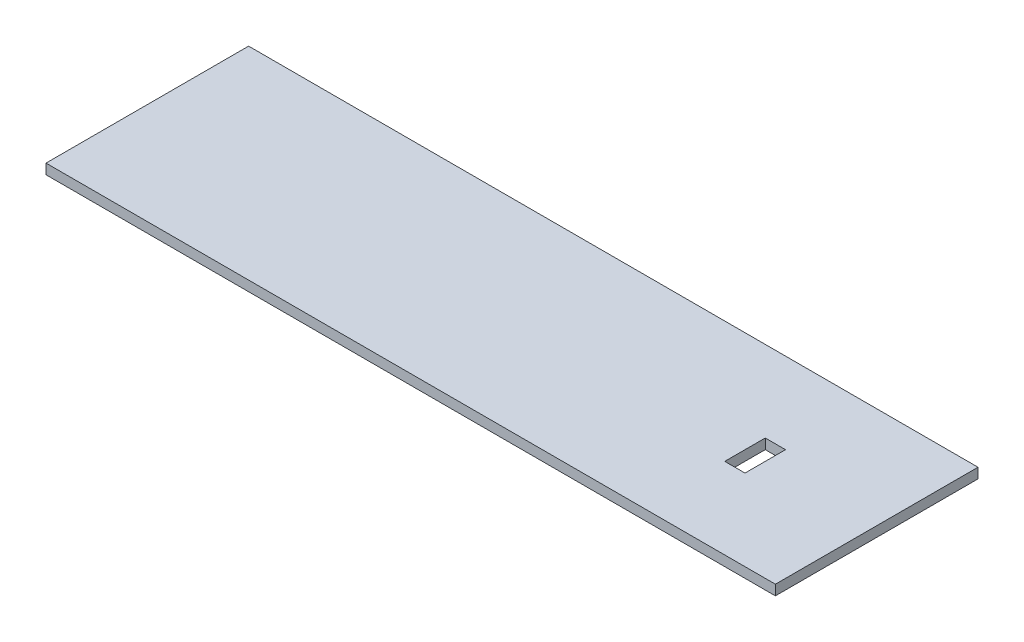
ISO-10303-21;
HEADER;
FILE_DESCRIPTION(('STEP AP214'),'2;1');
FILE_NAME('part.step','',(''),(''),'','','');
FILE_SCHEMA(('AUTOMOTIVE_DESIGN { 1 0 10303 214 1 1 1 1 }'));
ENDSEC;
DATA;
#1=APPLICATION_CONTEXT('core data for automotive mechanical design processes');
#2=APPLICATION_PROTOCOL_DEFINITION('international standard','automotive_design',2000,#1);
#3=PRODUCT_CONTEXT('',#1,'mechanical');
#4=PRODUCT('Part','Part','',(#3));
#5=PRODUCT_RELATED_PRODUCT_CATEGORY('part','',(#4));
#6=PRODUCT_DEFINITION_FORMATION('','',#4);
#7=PRODUCT_DEFINITION_CONTEXT('part definition',#1,'design');
#8=PRODUCT_DEFINITION('design','',#6,#7);
#9=PRODUCT_DEFINITION_SHAPE('','',#8);
#10=(LENGTH_UNIT() NAMED_UNIT(*) SI_UNIT(.MILLI.,.METRE.));
#11=(NAMED_UNIT(*) PLANE_ANGLE_UNIT() SI_UNIT($,.RADIAN.));
#12=(NAMED_UNIT(*) SI_UNIT($,.STERADIAN.) SOLID_ANGLE_UNIT());
#13=UNCERTAINTY_MEASURE_WITH_UNIT(LENGTH_MEASURE(1.E-05),#10,'distance_accuracy_value','');
#14=(GEOMETRIC_REPRESENTATION_CONTEXT(3) GLOBAL_UNCERTAINTY_ASSIGNED_CONTEXT((#13)) GLOBAL_UNIT_ASSIGNED_CONTEXT((#10,
#11,#12)) REPRESENTATION_CONTEXT('',''));
#15=CARTESIAN_POINT('',(0.,0.,0.));
#16=DIRECTION('',(0.,0.,1.));
#17=DIRECTION('',(1.,0.,0.));
#18=AXIS2_PLACEMENT_3D('',#15,#16,#17);
#19=CARTESIAN_POINT('',(360.,10.,100.));
#20=DIRECTION('',(-1.,0.,0.));
#21=DIRECTION('',(0.,0.,1.));
#22=AXIS2_PLACEMENT_3D('',#19,#20,#21);
#23=PLANE('',#22);
#24=DIRECTION('',(0.,0.,-1.));
#25=VECTOR('',#24,1.);
#26=CARTESIAN_POINT('',(360.,0.,100.));
#27=LINE('',#26,#25);
#28=CARTESIAN_POINT('',(360.,0.,100.));
#29=VERTEX_POINT('',#28);
#30=CARTESIAN_POINT('',(360.,0.,-100.));
#31=VERTEX_POINT('',#30);
#32=EDGE_CURVE('E128',#29,#31,#27,.T.);
#33=ORIENTED_EDGE('',*,*,#32,.T.);
#34=DIRECTION('',(0.,-1.,0.));
#35=VECTOR('',#34,1.);
#36=CARTESIAN_POINT('',(360.,10.,-100.));
#37=LINE('',#36,#35);
#38=CARTESIAN_POINT('',(360.,10.,-100.));
#39=VERTEX_POINT('',#38);
#40=EDGE_CURVE('E11',#39,#31,#37,.T.);
#41=ORIENTED_EDGE('',*,*,#40,.F.);
#42=DIRECTION('',(0.,0.,-1.));
#43=VECTOR('',#42,1.);
#44=CARTESIAN_POINT('',(360.,10.,100.));
#45=LINE('',#44,#43);
#46=CARTESIAN_POINT('',(360.,10.,100.));
#47=VERTEX_POINT('',#46);
#48=EDGE_CURVE('E132',#47,#39,#45,.T.);
#49=ORIENTED_EDGE('',*,*,#48,.F.);
#50=DIRECTION('',(0.,-1.,0.));
#51=VECTOR('',#50,1.);
#52=CARTESIAN_POINT('',(360.,10.,100.));
#53=LINE('',#52,#51);
#54=EDGE_CURVE('E142',#47,#29,#53,.T.);
#55=ORIENTED_EDGE('',*,*,#54,.T.);
#56=EDGE_LOOP('',(#33,#41,#49,#55));
#57=FACE_BOUND('',#56,.T.);
#58=ADVANCED_FACE('F33',(#57),#23,.F.);
#59=CARTESIAN_POINT('',(-360.,10.,-100.));
#60=DIRECTION('',(0.,0.,1.));
#61=DIRECTION('',(1.,0.,0.));
#62=AXIS2_PLACEMENT_3D('',#59,#60,#61);
#63=PLANE('',#62);
#64=DIRECTION('',(-1.,0.,0.));
#65=VECTOR('',#64,1.);
#66=CARTESIAN_POINT('',(-360.,0.,-100.));
#67=LINE('',#66,#65);
#68=CARTESIAN_POINT('',(-360.,0.,-100.));
#69=VERTEX_POINT('',#68);
#70=EDGE_CURVE('E145',#31,#69,#67,.T.);
#71=ORIENTED_EDGE('',*,*,#70,.T.);
#72=DIRECTION('',(0.,-1.,0.));
#73=VECTOR('',#72,1.);
#74=CARTESIAN_POINT('',(-360.,10.,-100.));
#75=LINE('',#74,#73);
#76=CARTESIAN_POINT('',(-360.,10.,-100.));
#77=VERTEX_POINT('',#76);
#78=EDGE_CURVE('E40',#77,#69,#75,.T.);
#79=ORIENTED_EDGE('',*,*,#78,.F.);
#80=DIRECTION('',(-1.,0.,0.));
#81=VECTOR('',#80,1.);
#82=CARTESIAN_POINT('',(-360.,10.,-100.));
#83=LINE('',#82,#81);
#84=EDGE_CURVE('E135',#39,#77,#83,.T.);
#85=ORIENTED_EDGE('',*,*,#84,.F.);
#86=ORIENTED_EDGE('',*,*,#40,.T.);
#87=EDGE_LOOP('',(#71,#79,#85,#86));
#88=FACE_BOUND('',#87,.T.);
#89=ADVANCED_FACE('F173',(#88),#63,.F.);
#90=CARTESIAN_POINT('',(-360.,10.,100.));
#91=DIRECTION('',(1.,0.,0.));
#92=DIRECTION('',(0.,0.,-1.));
#93=AXIS2_PLACEMENT_3D('',#90,#91,#92);
#94=PLANE('',#93);
#95=DIRECTION('',(0.,0.,1.));
#96=VECTOR('',#95,1.);
#97=CARTESIAN_POINT('',(-360.,0.,100.));
#98=LINE('',#97,#96);
#99=CARTESIAN_POINT('',(-360.,0.,100.));
#100=VERTEX_POINT('',#99);
#101=EDGE_CURVE('E147',#69,#100,#98,.T.);
#102=ORIENTED_EDGE('',*,*,#101,.T.);
#103=DIRECTION('',(0.,-1.,0.));
#104=VECTOR('',#103,1.);
#105=CARTESIAN_POINT('',(-360.,10.,100.));
#106=LINE('',#105,#104);
#107=CARTESIAN_POINT('',(-360.,10.,100.));
#108=VERTEX_POINT('',#107);
#109=EDGE_CURVE('E152',#108,#100,#106,.T.);
#110=ORIENTED_EDGE('',*,*,#109,.F.);
#111=DIRECTION('',(0.,0.,1.));
#112=VECTOR('',#111,1.);
#113=CARTESIAN_POINT('',(-360.,10.,100.));
#114=LINE('',#113,#112);
#115=EDGE_CURVE('E138',#77,#108,#114,.T.);
#116=ORIENTED_EDGE('',*,*,#115,.F.);
#117=ORIENTED_EDGE('',*,*,#78,.T.);
#118=EDGE_LOOP('',(#102,#110,#116,#117));
#119=FACE_BOUND('',#118,.T.);
#120=ADVANCED_FACE('F159',(#119),#94,.F.);
#121=CARTESIAN_POINT('',(-360.,10.,100.));
#122=DIRECTION('',(0.,0.,-1.));
#123=DIRECTION('',(-1.,0.,0.));
#124=AXIS2_PLACEMENT_3D('',#121,#122,#123);
#125=PLANE('',#124);
#126=DIRECTION('',(1.,0.,0.));
#127=VECTOR('',#126,1.);
#128=CARTESIAN_POINT('',(-360.,0.,100.));
#129=LINE('',#128,#127);
#130=EDGE_CURVE('E136',#100,#29,#129,.T.);
#131=ORIENTED_EDGE('',*,*,#130,.T.);
#132=ORIENTED_EDGE('',*,*,#54,.F.);
#133=DIRECTION('',(1.,0.,0.));
#134=VECTOR('',#133,1.);
#135=CARTESIAN_POINT('',(-360.,10.,100.));
#136=LINE('',#135,#134);
#137=EDGE_CURVE('E140',#108,#47,#136,.T.);
#138=ORIENTED_EDGE('',*,*,#137,.F.);
#139=ORIENTED_EDGE('',*,*,#109,.T.);
#140=EDGE_LOOP('',(#131,#132,#138,#139));
#141=FACE_BOUND('',#140,.T.);
#142=ADVANCED_FACE('F168',(#141),#125,.F.);
#143=CARTESIAN_POINT('',(0.,10.,0.));
#144=DIRECTION('',(0.,-1.,0.));
#145=DIRECTION('',(0.,0.,-1.));
#146=AXIS2_PLACEMENT_3D('',#143,#144,#145);
#147=PLANE('',#146);
#148=DIRECTION('',(-1.,0.,0.));
#149=VECTOR('',#148,1.);
#150=CARTESIAN_POINT('',(250.,10.,-20.));
#151=LINE('',#150,#149);
#152=CARTESIAN_POINT('',(250.,10.,-20.));
#153=VERTEX_POINT('',#152);
#154=CARTESIAN_POINT('',(230.,10.,-20.));
#155=VERTEX_POINT('',#154);
#156=EDGE_CURVE('E102',#153,#155,#151,.T.);
#157=ORIENTED_EDGE('',*,*,#156,.F.);
#158=DIRECTION('',(0.,0.,1.));
#159=VECTOR('',#158,1.);
#160=CARTESIAN_POINT('',(250.,10.,-20.));
#161=LINE('',#160,#159);
#162=CARTESIAN_POINT('',(250.,10.,20.));
#163=VERTEX_POINT('',#162);
#164=EDGE_CURVE('E99',#153,#163,#161,.T.);
#165=ORIENTED_EDGE('',*,*,#164,.T.);
#166=DIRECTION('',(-1.,0.,0.));
#167=VECTOR('',#166,1.);
#168=CARTESIAN_POINT('',(250.,10.,20.));
#169=LINE('',#168,#167);
#170=CARTESIAN_POINT('',(230.,10.,20.));
#171=VERTEX_POINT('',#170);
#172=EDGE_CURVE('E105',#163,#171,#169,.T.);
#173=ORIENTED_EDGE('',*,*,#172,.T.);
#174=DIRECTION('',(0.,0.,1.));
#175=VECTOR('',#174,1.);
#176=CARTESIAN_POINT('',(230.,10.,-20.));
#177=LINE('',#176,#175);
#178=EDGE_CURVE('E109',#155,#171,#177,.T.);
#179=ORIENTED_EDGE('',*,*,#178,.F.);
#180=EDGE_LOOP('',(#157,#165,#173,#179));
#181=FACE_BOUND('',#180,.T.);
#182=ORIENTED_EDGE('',*,*,#48,.T.);
#183=ORIENTED_EDGE('',*,*,#84,.T.);
#184=ORIENTED_EDGE('',*,*,#115,.T.);
#185=ORIENTED_EDGE('',*,*,#137,.T.);
#186=EDGE_LOOP('',(#182,#183,#184,#185));
#187=FACE_BOUND('',#186,.T.);
#188=ADVANCED_FACE('F111',(#181,#187),#147,.F.);
#189=CARTESIAN_POINT('',(0.,0.,0.));
#190=DIRECTION('',(0.,-1.,0.));
#191=DIRECTION('',(0.,0.,-1.));
#192=AXIS2_PLACEMENT_3D('',#189,#190,#191);
#193=PLANE('',#192);
#194=DIRECTION('',(0.,0.,1.));
#195=VECTOR('',#194,1.);
#196=CARTESIAN_POINT('',(250.,0.,-20.));
#197=LINE('',#196,#195);
#198=CARTESIAN_POINT('',(250.,0.,-20.));
#199=VERTEX_POINT('',#198);
#200=CARTESIAN_POINT('',(250.,0.,20.));
#201=VERTEX_POINT('',#200);
#202=EDGE_CURVE('E55',#199,#201,#197,.T.);
#203=ORIENTED_EDGE('',*,*,#202,.F.);
#204=DIRECTION('',(-1.,0.,0.));
#205=VECTOR('',#204,1.);
#206=CARTESIAN_POINT('',(250.,0.,-20.));
#207=LINE('',#206,#205);
#208=CARTESIAN_POINT('',(230.,0.,-20.));
#209=VERTEX_POINT('',#208);
#210=EDGE_CURVE('E113',#199,#209,#207,.T.);
#211=ORIENTED_EDGE('',*,*,#210,.T.);
#212=DIRECTION('',(0.,0.,1.));
#213=VECTOR('',#212,1.);
#214=CARTESIAN_POINT('',(230.,0.,-20.));
#215=LINE('',#214,#213);
#216=CARTESIAN_POINT('',(230.,0.,20.));
#217=VERTEX_POINT('',#216);
#218=EDGE_CURVE('E116',#209,#217,#215,.T.);
#219=ORIENTED_EDGE('',*,*,#218,.T.);
#220=DIRECTION('',(-1.,0.,0.));
#221=VECTOR('',#220,1.);
#222=CARTESIAN_POINT('',(250.,0.,20.));
#223=LINE('',#222,#221);
#224=EDGE_CURVE('E122',#201,#217,#223,.T.);
#225=ORIENTED_EDGE('',*,*,#224,.F.);
#226=EDGE_LOOP('',(#203,#211,#219,#225));
#227=FACE_BOUND('',#226,.T.);
#228=ORIENTED_EDGE('',*,*,#32,.F.);
#229=ORIENTED_EDGE('',*,*,#130,.F.);
#230=ORIENTED_EDGE('',*,*,#101,.F.);
#231=ORIENTED_EDGE('',*,*,#70,.F.);
#232=EDGE_LOOP('',(#228,#229,#230,#231));
#233=FACE_BOUND('',#232,.T.);
#234=ADVANCED_FACE('F165',(#227,#233),#193,.T.);
#235=CARTESIAN_POINT('',(250.,10.,-20.));
#236=DIRECTION('',(1.,0.,0.));
#237=DIRECTION('',(0.,0.,-1.));
#238=AXIS2_PLACEMENT_3D('',#235,#236,#237);
#239=PLANE('',#238);
#240=ORIENTED_EDGE('',*,*,#202,.T.);
#241=DIRECTION('',(0.,-1.,0.));
#242=VECTOR('',#241,1.);
#243=CARTESIAN_POINT('',(250.,10.,20.));
#244=LINE('',#243,#242);
#245=EDGE_CURVE('E96',#163,#201,#244,.T.);
#246=ORIENTED_EDGE('',*,*,#245,.F.);
#247=ORIENTED_EDGE('',*,*,#164,.F.);
#248=DIRECTION('',(0.,-1.,0.));
#249=VECTOR('',#248,1.);
#250=CARTESIAN_POINT('',(250.,10.,-20.));
#251=LINE('',#250,#249);
#252=EDGE_CURVE('E126',#153,#199,#251,.T.);
#253=ORIENTED_EDGE('',*,*,#252,.T.);
#254=EDGE_LOOP('',(#240,#246,#247,#253));
#255=FACE_BOUND('',#254,.T.);
#256=ADVANCED_FACE('F97',(#255),#239,.F.);
#257=CARTESIAN_POINT('',(250.,10.,-20.));
#258=DIRECTION('',(0.,0.,1.));
#259=DIRECTION('',(1.,0.,0.));
#260=AXIS2_PLACEMENT_3D('',#257,#258,#259);
#261=PLANE('',#260);
#262=ORIENTED_EDGE('',*,*,#210,.F.);
#263=ORIENTED_EDGE('',*,*,#252,.F.);
#264=ORIENTED_EDGE('',*,*,#156,.T.);
#265=DIRECTION('',(0.,-1.,0.));
#266=VECTOR('',#265,1.);
#267=CARTESIAN_POINT('',(230.,10.,-20.));
#268=LINE('',#267,#266);
#269=EDGE_CURVE('E129',#155,#209,#268,.T.);
#270=ORIENTED_EDGE('',*,*,#269,.T.);
#271=EDGE_LOOP('',(#262,#263,#264,#270));
#272=FACE_BOUND('',#271,.T.);
#273=ADVANCED_FACE('F190',(#272),#261,.T.);
#274=CARTESIAN_POINT('',(230.,10.,-20.));
#275=DIRECTION('',(1.,0.,0.));
#276=DIRECTION('',(0.,0.,-1.));
#277=AXIS2_PLACEMENT_3D('',#274,#275,#276);
#278=PLANE('',#277);
#279=ORIENTED_EDGE('',*,*,#218,.F.);
#280=ORIENTED_EDGE('',*,*,#269,.F.);
#281=ORIENTED_EDGE('',*,*,#178,.T.);
#282=DIRECTION('',(0.,-1.,0.));
#283=VECTOR('',#282,1.);
#284=CARTESIAN_POINT('',(230.,10.,20.));
#285=LINE('',#284,#283);
#286=EDGE_CURVE('E47',#171,#217,#285,.T.);
#287=ORIENTED_EDGE('',*,*,#286,.T.);
#288=EDGE_LOOP('',(#279,#280,#281,#287));
#289=FACE_BOUND('',#288,.T.);
#290=ADVANCED_FACE('F193',(#289),#278,.T.);
#291=CARTESIAN_POINT('',(250.,10.,20.));
#292=DIRECTION('',(0.,0.,1.));
#293=DIRECTION('',(1.,0.,0.));
#294=AXIS2_PLACEMENT_3D('',#291,#292,#293);
#295=PLANE('',#294);
#296=ORIENTED_EDGE('',*,*,#224,.T.);
#297=ORIENTED_EDGE('',*,*,#286,.F.);
#298=ORIENTED_EDGE('',*,*,#172,.F.);
#299=ORIENTED_EDGE('',*,*,#245,.T.);
#300=EDGE_LOOP('',(#296,#297,#298,#299));
#301=FACE_BOUND('',#300,.T.);
#302=ADVANCED_FACE('F106',(#301),#295,.F.);
#303=CLOSED_SHELL('',(#58,#89,#120,#142,#188,#234,#256,#273,#290,#302));
#304=MANIFOLD_SOLID_BREP('B2',#303);
#305=ADVANCED_BREP_SHAPE_REPRESENTATION('',(#18,#304),#14);
#306=SHAPE_DEFINITION_REPRESENTATION(#9,#305);
ENDSEC;
END-ISO-10303-21;
